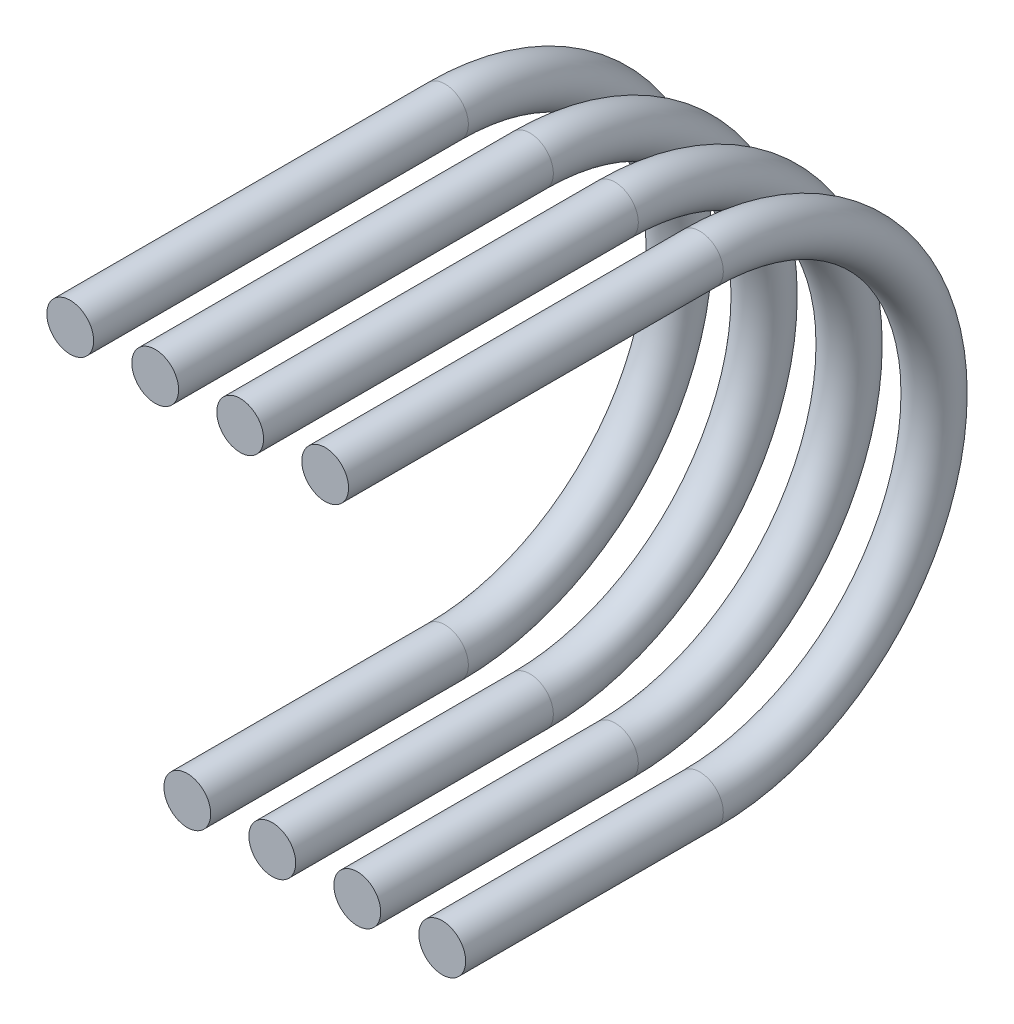
ISO-10303-21;
HEADER;
FILE_DESCRIPTION(('STEP AP214'),'2;1');
FILE_NAME('part.step','',(''),(''),'','','');
FILE_SCHEMA(('AUTOMOTIVE_DESIGN { 1 0 10303 214 1 1 1 1 }'));
ENDSEC;
DATA;
#1=APPLICATION_CONTEXT('core data for automotive mechanical design processes');
#2=APPLICATION_PROTOCOL_DEFINITION('international standard','automotive_design',2000,#1);
#3=PRODUCT_CONTEXT('',#1,'mechanical');
#4=PRODUCT('Part','Part','',(#3));
#5=PRODUCT_RELATED_PRODUCT_CATEGORY('part','',(#4));
#6=PRODUCT_DEFINITION_FORMATION('','',#4);
#7=PRODUCT_DEFINITION_CONTEXT('part definition',#1,'design');
#8=PRODUCT_DEFINITION('design','',#6,#7);
#9=PRODUCT_DEFINITION_SHAPE('','',#8);
#10=(LENGTH_UNIT() NAMED_UNIT(*) SI_UNIT(.MILLI.,.METRE.));
#11=(NAMED_UNIT(*) PLANE_ANGLE_UNIT() SI_UNIT($,.RADIAN.));
#12=(NAMED_UNIT(*) SI_UNIT($,.STERADIAN.) SOLID_ANGLE_UNIT());
#13=UNCERTAINTY_MEASURE_WITH_UNIT(LENGTH_MEASURE(1.E-05),#10,'distance_accuracy_value','');
#14=(GEOMETRIC_REPRESENTATION_CONTEXT(3) GLOBAL_UNCERTAINTY_ASSIGNED_CONTEXT((#13)) GLOBAL_UNIT_ASSIGNED_CONTEXT((#10,
#11,#12)) REPRESENTATION_CONTEXT('',''));
#15=CARTESIAN_POINT('',(0.,0.,0.));
#16=DIRECTION('',(0.,0.,1.));
#17=DIRECTION('',(1.,0.,0.));
#18=AXIS2_PLACEMENT_3D('',#15,#16,#17);
#19=CARTESIAN_POINT('',(0.,0.,0.));
#20=DIRECTION('',(0.,0.,1.));
#21=DIRECTION('',(1.,0.,0.));
#22=AXIS2_PLACEMENT_3D('',#19,#20,#21);
#23=PLANE('',#22);
#24=CARTESIAN_POINT('',(0.,0.,0.));
#25=DIRECTION('',(0.,0.,1.));
#26=DIRECTION('',(1.,0.,0.));
#27=AXIS2_PLACEMENT_3D('',#24,#25,#26);
#28=CIRCLE('',#27,0.7);
#29=CARTESIAN_POINT('',(0.7,0.,0.));
#30=VERTEX_POINT('',#29);
#31=EDGE_CURVE('P0_E10',#30,#30,#28,.T.);
#32=ORIENTED_EDGE('',*,*,#31,.T.);
#33=EDGE_LOOP('',(#32));
#34=FACE_BOUND('',#33,.T.);
#35=ADVANCED_FACE('P0_F15',(#34),#23,.T.);
#36=CARTESIAN_POINT('',(0.,14.,3.5));
#37=DIRECTION('',(0.,0.,-1.));
#38=DIRECTION('',(0.,-1.,0.));
#39=AXIS2_PLACEMENT_3D('',#36,#37,#38);
#40=PLANE('',#39);
#41=CARTESIAN_POINT('',(0.,14.,3.5));
#42=DIRECTION('',(0.,0.,-1.));
#43=DIRECTION('',(1.,0.,0.));
#44=AXIS2_PLACEMENT_3D('',#41,#42,#43);
#45=CIRCLE('',#44,0.7);
#46=CARTESIAN_POINT('',(0.7,14.,3.5));
#47=VERTEX_POINT('',#46);
#48=EDGE_CURVE('P0_E23',#47,#47,#45,.T.);
#49=ORIENTED_EDGE('',*,*,#48,.F.);
#50=EDGE_LOOP('',(#49));
#51=FACE_BOUND('',#50,.T.);
#52=ADVANCED_FACE('P0_F17',(#51),#40,.F.);
#53=CARTESIAN_POINT('',(0.,0.,0.));
#54=DIRECTION('',(0.,0.,-1.));
#55=DIRECTION('',(0.,1.,0.));
#56=AXIS2_PLACEMENT_3D('',#53,#54,#55);
#57=CYLINDRICAL_SURFACE('',#56,0.7);
#58=CARTESIAN_POINT('',(0.,0.,-7.7));
#59=DIRECTION('',(0.,0.,1.));
#60=DIRECTION('',(1.,0.,0.));
#61=AXIS2_PLACEMENT_3D('',#58,#59,#60);
#62=CIRCLE('',#61,0.7);
#63=CARTESIAN_POINT('',(0.,-0.7,-7.7));
#64=VERTEX_POINT('',#63);
#65=EDGE_CURVE('P0_E32',#64,#64,#62,.T.);
#66=ORIENTED_EDGE('',*,*,#65,.T.);
#67=EDGE_LOOP('',(#66));
#68=FACE_BOUND('',#67,.T.);
#69=ORIENTED_EDGE('',*,*,#31,.F.);
#70=EDGE_LOOP('',(#69));
#71=FACE_BOUND('',#70,.T.);
#72=ADVANCED_FACE('P0_F53',(#68,#71),#57,.T.);
#73=CARTESIAN_POINT('',(0.,14.,-7.7));
#74=DIRECTION('',(0.,0.,1.));
#75=DIRECTION('',(0.,-1.,0.));
#76=AXIS2_PLACEMENT_3D('',#73,#74,#75);
#77=CYLINDRICAL_SURFACE('',#76,0.7);
#78=ORIENTED_EDGE('',*,*,#48,.T.);
#79=EDGE_LOOP('',(#78));
#80=FACE_BOUND('',#79,.T.);
#81=CARTESIAN_POINT('',(0.,14.,-7.7));
#82=DIRECTION('',(0.,0.,-1.));
#83=DIRECTION('',(1.,0.,0.));
#84=AXIS2_PLACEMENT_3D('',#81,#82,#83);
#85=CIRCLE('',#84,0.7);
#86=CARTESIAN_POINT('',(0.,14.7,-7.7));
#87=VERTEX_POINT('',#86);
#88=EDGE_CURVE('P0_E40',#87,#87,#85,.T.);
#89=ORIENTED_EDGE('',*,*,#88,.F.);
#90=EDGE_LOOP('',(#89));
#91=FACE_BOUND('',#90,.T.);
#92=ADVANCED_FACE('P0_F51',(#80,#91),#77,.T.);
#93=CARTESIAN_POINT('',(0.,7.,-7.7));
#94=DIRECTION('',(1.,0.,0.));
#95=DIRECTION('',(0.,0.,-1.));
#96=AXIS2_PLACEMENT_3D('',#93,#94,#95);
#97=TOROIDAL_SURFACE('',#96,7.,0.7);
#98=CARTESIAN_POINT('',(0.,7.,-7.7));
#99=DIRECTION('',(1.,0.,0.));
#100=DIRECTION('',(0.,0.,-1.));
#101=AXIS2_PLACEMENT_3D('',#98,#99,#100);
#102=CIRCLE('',#101,7.7);
#103=EDGE_CURVE('',#64,#87,#102,.T.);
#104=ORIENTED_EDGE('',*,*,#65,.F.);
#105=ORIENTED_EDGE('',*,*,#88,.T.);
#106=ORIENTED_EDGE('',*,*,#103,.T.);
#107=ORIENTED_EDGE('',*,*,#103,.F.);
#108=EDGE_LOOP('',(#104,#106,#105,#107));
#109=FACE_BOUND('',#108,.T.);
#110=ADVANCED_FACE('P0_F48',(#109),#97,.T.);
#111=CLOSED_SHELL('',(#35,#52,#72,#92,#110));
#112=MANIFOLD_SOLID_BREP('P0_B1',#111);
#113=CARTESIAN_POINT('',(2.54,0.,0.));
#114=DIRECTION('',(0.,0.,1.));
#115=DIRECTION('',(1.,0.,0.));
#116=AXIS2_PLACEMENT_3D('',#113,#114,#115);
#117=PLANE('',#116);
#118=CARTESIAN_POINT('',(2.54,0.,0.));
#119=DIRECTION('',(0.,0.,1.));
#120=DIRECTION('',(1.,0.,0.));
#121=AXIS2_PLACEMENT_3D('',#118,#119,#120);
#122=CIRCLE('',#121,0.7);
#123=CARTESIAN_POINT('',(3.24,0.,0.));
#124=VERTEX_POINT('',#123);
#125=EDGE_CURVE('P1_E10',#124,#124,#122,.T.);
#126=ORIENTED_EDGE('',*,*,#125,.T.);
#127=EDGE_LOOP('',(#126));
#128=FACE_BOUND('',#127,.T.);
#129=ADVANCED_FACE('P1_F15',(#128),#117,.T.);
#130=CARTESIAN_POINT('',(2.54,14.,3.5));
#131=DIRECTION('',(0.,0.,-1.));
#132=DIRECTION('',(0.,-1.,0.));
#133=AXIS2_PLACEMENT_3D('',#130,#131,#132);
#134=PLANE('',#133);
#135=CARTESIAN_POINT('',(2.54,14.,3.5));
#136=DIRECTION('',(0.,0.,-1.));
#137=DIRECTION('',(1.,0.,0.));
#138=AXIS2_PLACEMENT_3D('',#135,#136,#137);
#139=CIRCLE('',#138,0.7);
#140=CARTESIAN_POINT('',(3.24,14.,3.5));
#141=VERTEX_POINT('',#140);
#142=EDGE_CURVE('P1_E19',#141,#141,#139,.T.);
#143=ORIENTED_EDGE('',*,*,#142,.F.);
#144=EDGE_LOOP('',(#143));
#145=FACE_BOUND('',#144,.T.);
#146=ADVANCED_FACE('P1_F17',(#145),#134,.F.);
#147=CARTESIAN_POINT('',(2.54,0.,0.));
#148=DIRECTION('',(0.,0.,-1.));
#149=DIRECTION('',(0.,1.,0.));
#150=AXIS2_PLACEMENT_3D('',#147,#148,#149);
#151=CYLINDRICAL_SURFACE('',#150,0.7);
#152=CARTESIAN_POINT('',(2.54,0.,-7.7));
#153=DIRECTION('',(0.,0.,1.));
#154=DIRECTION('',(1.,0.,0.));
#155=AXIS2_PLACEMENT_3D('',#152,#153,#154);
#156=CIRCLE('',#155,0.7);
#157=CARTESIAN_POINT('',(2.54,-0.7,-7.7));
#158=VERTEX_POINT('',#157);
#159=EDGE_CURVE('P1_E33',#158,#158,#156,.T.);
#160=ORIENTED_EDGE('',*,*,#159,.T.);
#161=EDGE_LOOP('',(#160));
#162=FACE_BOUND('',#161,.T.);
#163=ORIENTED_EDGE('',*,*,#125,.F.);
#164=EDGE_LOOP('',(#163));
#165=FACE_BOUND('',#164,.T.);
#166=ADVANCED_FACE('P1_F48',(#162,#165),#151,.T.);
#167=CARTESIAN_POINT('',(2.54,14.,-7.7));
#168=DIRECTION('',(0.,0.,1.));
#169=DIRECTION('',(0.,-1.,0.));
#170=AXIS2_PLACEMENT_3D('',#167,#168,#169);
#171=CYLINDRICAL_SURFACE('',#170,0.7);
#172=ORIENTED_EDGE('',*,*,#142,.T.);
#173=EDGE_LOOP('',(#172));
#174=FACE_BOUND('',#173,.T.);
#175=CARTESIAN_POINT('',(2.54,14.,-7.7));
#176=DIRECTION('',(0.,0.,-1.));
#177=DIRECTION('',(1.,0.,0.));
#178=AXIS2_PLACEMENT_3D('',#175,#176,#177);
#179=CIRCLE('',#178,0.7);
#180=CARTESIAN_POINT('',(2.54,14.7,-7.7));
#181=VERTEX_POINT('',#180);
#182=EDGE_CURVE('P1_E35',#181,#181,#179,.T.);
#183=ORIENTED_EDGE('',*,*,#182,.F.);
#184=EDGE_LOOP('',(#183));
#185=FACE_BOUND('',#184,.T.);
#186=ADVANCED_FACE('P1_F53',(#174,#185),#171,.T.);
#187=CARTESIAN_POINT('',(2.54,7.,-7.7));
#188=DIRECTION('',(1.,0.,0.));
#189=DIRECTION('',(0.,0.,-1.));
#190=AXIS2_PLACEMENT_3D('',#187,#188,#189);
#191=TOROIDAL_SURFACE('',#190,7.,0.7);
#192=CARTESIAN_POINT('',(2.54,7.,-7.7));
#193=DIRECTION('',(1.,0.,0.));
#194=DIRECTION('',(0.,0.,-1.));
#195=AXIS2_PLACEMENT_3D('',#192,#193,#194);
#196=CIRCLE('',#195,7.7);
#197=EDGE_CURVE('',#158,#181,#196,.T.);
#198=ORIENTED_EDGE('',*,*,#159,.F.);
#199=ORIENTED_EDGE('',*,*,#182,.T.);
#200=ORIENTED_EDGE('',*,*,#197,.T.);
#201=ORIENTED_EDGE('',*,*,#197,.F.);
#202=EDGE_LOOP('',(#198,#200,#199,#201));
#203=FACE_BOUND('',#202,.T.);
#204=ADVANCED_FACE('P1_F51',(#203),#191,.T.);
#205=CLOSED_SHELL('',(#129,#146,#166,#186,#204));
#206=MANIFOLD_SOLID_BREP('P1_B1',#205);
#207=CARTESIAN_POINT('',(5.08,0.,0.));
#208=DIRECTION('',(0.,0.,1.));
#209=DIRECTION('',(1.,0.,0.));
#210=AXIS2_PLACEMENT_3D('',#207,#208,#209);
#211=PLANE('',#210);
#212=CARTESIAN_POINT('',(5.08,0.,0.));
#213=DIRECTION('',(0.,0.,1.));
#214=DIRECTION('',(1.,0.,0.));
#215=AXIS2_PLACEMENT_3D('',#212,#213,#214);
#216=CIRCLE('',#215,0.7);
#217=CARTESIAN_POINT('',(5.78,0.,0.));
#218=VERTEX_POINT('',#217);
#219=EDGE_CURVE('P2_E10',#218,#218,#216,.T.);
#220=ORIENTED_EDGE('',*,*,#219,.T.);
#221=EDGE_LOOP('',(#220));
#222=FACE_BOUND('',#221,.T.);
#223=ADVANCED_FACE('P2_F15',(#222),#211,.T.);
#224=CARTESIAN_POINT('',(5.08,14.,3.5));
#225=DIRECTION('',(0.,0.,-1.));
#226=DIRECTION('',(0.,-1.,0.));
#227=AXIS2_PLACEMENT_3D('',#224,#225,#226);
#228=PLANE('',#227);
#229=CARTESIAN_POINT('',(5.08,14.,3.5));
#230=DIRECTION('',(0.,0.,-1.));
#231=DIRECTION('',(1.,0.,0.));
#232=AXIS2_PLACEMENT_3D('',#229,#230,#231);
#233=CIRCLE('',#232,0.7);
#234=CARTESIAN_POINT('',(5.78,14.,3.5));
#235=VERTEX_POINT('',#234);
#236=EDGE_CURVE('P2_E23',#235,#235,#233,.T.);
#237=ORIENTED_EDGE('',*,*,#236,.F.);
#238=EDGE_LOOP('',(#237));
#239=FACE_BOUND('',#238,.T.);
#240=ADVANCED_FACE('P2_F61',(#239),#228,.F.);
#241=CARTESIAN_POINT('',(5.08,0.,0.));
#242=DIRECTION('',(0.,0.,-1.));
#243=DIRECTION('',(0.,1.,0.));
#244=AXIS2_PLACEMENT_3D('',#241,#242,#243);
#245=CYLINDRICAL_SURFACE('',#244,0.7);
#246=CARTESIAN_POINT('',(5.08,0.,-7.7));
#247=DIRECTION('',(0.,0.,1.));
#248=DIRECTION('',(1.,0.,0.));
#249=AXIS2_PLACEMENT_3D('',#246,#247,#248);
#250=CIRCLE('',#249,0.7);
#251=CARTESIAN_POINT('',(5.08,-0.7,-7.7));
#252=VERTEX_POINT('',#251);
#253=EDGE_CURVE('P2_E18',#252,#252,#250,.T.);
#254=ORIENTED_EDGE('',*,*,#253,.T.);
#255=EDGE_LOOP('',(#254));
#256=FACE_BOUND('',#255,.T.);
#257=ORIENTED_EDGE('',*,*,#219,.F.);
#258=EDGE_LOOP('',(#257));
#259=FACE_BOUND('',#258,.T.);
#260=ADVANCED_FACE('P2_F47',(#256,#259),#245,.T.);
#261=CARTESIAN_POINT('',(5.08,14.,-7.7));
#262=DIRECTION('',(0.,0.,1.));
#263=DIRECTION('',(0.,-1.,0.));
#264=AXIS2_PLACEMENT_3D('',#261,#262,#263);
#265=CYLINDRICAL_SURFACE('',#264,0.7);
#266=ORIENTED_EDGE('',*,*,#236,.T.);
#267=EDGE_LOOP('',(#266));
#268=FACE_BOUND('',#267,.T.);
#269=CARTESIAN_POINT('',(5.08,14.,-7.7));
#270=DIRECTION('',(0.,0.,-1.));
#271=DIRECTION('',(1.,0.,0.));
#272=AXIS2_PLACEMENT_3D('',#269,#270,#271);
#273=CIRCLE('',#272,0.7);
#274=CARTESIAN_POINT('',(5.08,14.7,-7.7));
#275=VERTEX_POINT('',#274);
#276=EDGE_CURVE('P2_E34',#275,#275,#273,.T.);
#277=ORIENTED_EDGE('',*,*,#276,.F.);
#278=EDGE_LOOP('',(#277));
#279=FACE_BOUND('',#278,.T.);
#280=ADVANCED_FACE('P2_F52',(#268,#279),#265,.T.);
#281=CARTESIAN_POINT('',(5.08,7.,-7.7));
#282=DIRECTION('',(1.,0.,0.));
#283=DIRECTION('',(0.,0.,-1.));
#284=AXIS2_PLACEMENT_3D('',#281,#282,#283);
#285=TOROIDAL_SURFACE('',#284,7.,0.7);
#286=CARTESIAN_POINT('',(5.08,7.,-7.7));
#287=DIRECTION('',(1.,0.,0.));
#288=DIRECTION('',(0.,0.,-1.));
#289=AXIS2_PLACEMENT_3D('',#286,#287,#288);
#290=CIRCLE('',#289,7.7);
#291=EDGE_CURVE('',#252,#275,#290,.T.);
#292=ORIENTED_EDGE('',*,*,#253,.F.);
#293=ORIENTED_EDGE('',*,*,#276,.T.);
#294=ORIENTED_EDGE('',*,*,#291,.T.);
#295=ORIENTED_EDGE('',*,*,#291,.F.);
#296=EDGE_LOOP('',(#292,#294,#293,#295));
#297=FACE_BOUND('',#296,.T.);
#298=ADVANCED_FACE('P2_F50',(#297),#285,.T.);
#299=CLOSED_SHELL('',(#223,#240,#260,#280,#298));
#300=MANIFOLD_SOLID_BREP('P2_B1',#299);
#301=CARTESIAN_POINT('',(7.62,0.,0.));
#302=DIRECTION('',(0.,0.,1.));
#303=DIRECTION('',(1.,0.,0.));
#304=AXIS2_PLACEMENT_3D('',#301,#302,#303);
#305=PLANE('',#304);
#306=CARTESIAN_POINT('',(7.62,0.,0.));
#307=DIRECTION('',(0.,0.,1.));
#308=DIRECTION('',(1.,0.,0.));
#309=AXIS2_PLACEMENT_3D('',#306,#307,#308);
#310=CIRCLE('',#309,0.7);
#311=CARTESIAN_POINT('',(8.32,0.,0.));
#312=VERTEX_POINT('',#311);
#313=EDGE_CURVE('P3_E9',#312,#312,#310,.T.);
#314=ORIENTED_EDGE('',*,*,#313,.T.);
#315=EDGE_LOOP('',(#314));
#316=FACE_BOUND('',#315,.T.);
#317=ADVANCED_FACE('P3_F14',(#316),#305,.T.);
#318=CARTESIAN_POINT('',(7.62,14.,3.5));
#319=DIRECTION('',(0.,0.,-1.));
#320=DIRECTION('',(0.,-1.,0.));
#321=AXIS2_PLACEMENT_3D('',#318,#319,#320);
#322=PLANE('',#321);
#323=CARTESIAN_POINT('',(7.62,14.,3.5));
#324=DIRECTION('',(0.,0.,-1.));
#325=DIRECTION('',(1.,0.,0.));
#326=AXIS2_PLACEMENT_3D('',#323,#324,#325);
#327=CIRCLE('',#326,0.7);
#328=CARTESIAN_POINT('',(8.32,14.,3.5));
#329=VERTEX_POINT('',#328);
#330=EDGE_CURVE('P3_E18',#329,#329,#327,.T.);
#331=ORIENTED_EDGE('',*,*,#330,.F.);
#332=EDGE_LOOP('',(#331));
#333=FACE_BOUND('',#332,.T.);
#334=ADVANCED_FACE('P3_F16',(#333),#322,.F.);
#335=CARTESIAN_POINT('',(7.62,0.,0.));
#336=DIRECTION('',(0.,0.,-1.));
#337=DIRECTION('',(0.,1.,0.));
#338=AXIS2_PLACEMENT_3D('',#335,#336,#337);
#339=CYLINDRICAL_SURFACE('',#338,0.7);
#340=CARTESIAN_POINT('',(7.62,0.,-7.7));
#341=DIRECTION('',(0.,0.,1.));
#342=DIRECTION('',(1.,0.,0.));
#343=AXIS2_PLACEMENT_3D('',#340,#341,#342);
#344=CIRCLE('',#343,0.7);
#345=CARTESIAN_POINT('',(7.62,-0.7,-7.7));
#346=VERTEX_POINT('',#345);
#347=EDGE_CURVE('P3_E32',#346,#346,#344,.T.);
#348=ORIENTED_EDGE('',*,*,#347,.T.);
#349=EDGE_LOOP('',(#348));
#350=FACE_BOUND('',#349,.T.);
#351=ORIENTED_EDGE('',*,*,#313,.F.);
#352=EDGE_LOOP('',(#351));
#353=FACE_BOUND('',#352,.T.);
#354=ADVANCED_FACE('P3_F43',(#350,#353),#339,.T.);
#355=CARTESIAN_POINT('',(7.62,14.,-7.7));
#356=DIRECTION('',(0.,0.,1.));
#357=DIRECTION('',(0.,-1.,0.));
#358=AXIS2_PLACEMENT_3D('',#355,#356,#357);
#359=CYLINDRICAL_SURFACE('',#358,0.7);
#360=ORIENTED_EDGE('',*,*,#330,.T.);
#361=EDGE_LOOP('',(#360));
#362=FACE_BOUND('',#361,.T.);
#363=CARTESIAN_POINT('',(7.62,14.,-7.7));
#364=DIRECTION('',(0.,0.,-1.));
#365=DIRECTION('',(1.,0.,0.));
#366=AXIS2_PLACEMENT_3D('',#363,#364,#365);
#367=CIRCLE('',#366,0.7);
#368=CARTESIAN_POINT('',(7.62,14.7,-7.7));
#369=VERTEX_POINT('',#368);
#370=EDGE_CURVE('P3_E34',#369,#369,#367,.T.);
#371=ORIENTED_EDGE('',*,*,#370,.F.);
#372=EDGE_LOOP('',(#371));
#373=FACE_BOUND('',#372,.T.);
#374=ADVANCED_FACE('P3_F48',(#362,#373),#359,.T.);
#375=CARTESIAN_POINT('',(7.62,7.,-7.7));
#376=DIRECTION('',(1.,0.,0.));
#377=DIRECTION('',(0.,0.,-1.));
#378=AXIS2_PLACEMENT_3D('',#375,#376,#377);
#379=TOROIDAL_SURFACE('',#378,7.,0.7);
#380=CARTESIAN_POINT('',(7.62,7.,-7.7));
#381=DIRECTION('',(1.,0.,0.));
#382=DIRECTION('',(0.,0.,-1.));
#383=AXIS2_PLACEMENT_3D('',#380,#381,#382);
#384=CIRCLE('',#383,7.7);
#385=EDGE_CURVE('',#346,#369,#384,.T.);
#386=ORIENTED_EDGE('',*,*,#347,.F.);
#387=ORIENTED_EDGE('',*,*,#370,.T.);
#388=ORIENTED_EDGE('',*,*,#385,.T.);
#389=ORIENTED_EDGE('',*,*,#385,.F.);
#390=EDGE_LOOP('',(#386,#388,#387,#389));
#391=FACE_BOUND('',#390,.T.);
#392=ADVANCED_FACE('P3_F46',(#391),#379,.T.);
#393=CLOSED_SHELL('',(#317,#334,#354,#374,#392));
#394=MANIFOLD_SOLID_BREP('P3_B1',#393);
#395=ADVANCED_BREP_SHAPE_REPRESENTATION('',(#18,#112,#206,#300,#394),#14);
#396=SHAPE_DEFINITION_REPRESENTATION(#9,#395);
ENDSEC;
END-ISO-10303-21;
